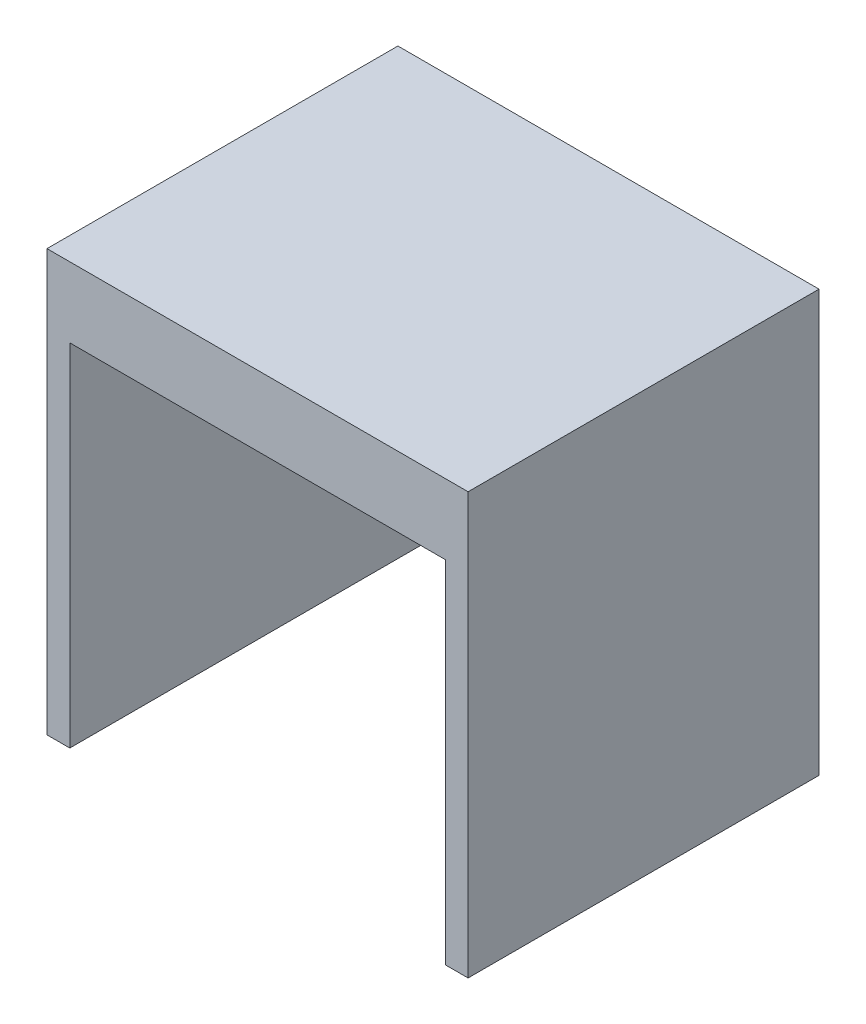
ISO-10303-21;
HEADER;
FILE_DESCRIPTION(('STEP AP214'),'2;1');
FILE_NAME('part.step','',(''),(''),'','','');
FILE_SCHEMA(('AUTOMOTIVE_DESIGN { 1 0 10303 214 1 1 1 1 }'));
ENDSEC;
DATA;
#1=APPLICATION_CONTEXT('core data for automotive mechanical design processes');
#2=APPLICATION_PROTOCOL_DEFINITION('international standard','automotive_design',2000,#1);
#3=PRODUCT_CONTEXT('',#1,'mechanical');
#4=PRODUCT('Part','Part','',(#3));
#5=PRODUCT_RELATED_PRODUCT_CATEGORY('part','',(#4));
#6=PRODUCT_DEFINITION_FORMATION('','',#4);
#7=PRODUCT_DEFINITION_CONTEXT('part definition',#1,'design');
#8=PRODUCT_DEFINITION('design','',#6,#7);
#9=PRODUCT_DEFINITION_SHAPE('','',#8);
#10=(LENGTH_UNIT() NAMED_UNIT(*) SI_UNIT(.MILLI.,.METRE.));
#11=(NAMED_UNIT(*) PLANE_ANGLE_UNIT() SI_UNIT($,.RADIAN.));
#12=(NAMED_UNIT(*) SI_UNIT($,.STERADIAN.) SOLID_ANGLE_UNIT());
#13=UNCERTAINTY_MEASURE_WITH_UNIT(LENGTH_MEASURE(1.E-05),#10,'distance_accuracy_value','');
#14=(GEOMETRIC_REPRESENTATION_CONTEXT(3) GLOBAL_UNCERTAINTY_ASSIGNED_CONTEXT((#13)) GLOBAL_UNIT_ASSIGNED_CONTEXT((#10,
#11,#12)) REPRESENTATION_CONTEXT('',''));
#15=CARTESIAN_POINT('',(0.,0.,0.));
#16=DIRECTION('',(0.,0.,1.));
#17=DIRECTION('',(1.,0.,0.));
#18=AXIS2_PLACEMENT_3D('',#15,#16,#17);
#19=CARTESIAN_POINT('',(38.5843649662009,102.731854475561,45.0000000000001));
#20=DIRECTION('',(0.,-1.,0.));
#21=DIRECTION('',(0.,0.,-1.));
#22=AXIS2_PLACEMENT_3D('',#19,#20,#21);
#23=PLANE('',#22);
#24=DIRECTION('',(-1.,0.,0.));
#25=VECTOR('',#24,1.);
#26=CARTESIAN_POINT('',(38.5843649662009,102.731854475561,-49.9999999999999));
#27=LINE('',#26,#25);
#28=CARTESIAN_POINT('',(38.5843649662009,102.731854475561,-49.9999999999999));
#29=VERTEX_POINT('',#28);
#30=CARTESIAN_POINT('',(-46.4156350337991,102.731854475561,-49.9999999999999));
#31=VERTEX_POINT('',#30);
#32=EDGE_CURVE('E191',#29,#31,#27,.T.);
#33=ORIENTED_EDGE('',*,*,#32,.T.);
#34=DIRECTION('',(0.,0.,-1.));
#35=VECTOR('',#34,1.);
#36=CARTESIAN_POINT('',(-46.4156350337991,102.731854475561,45.0000000000001));
#37=LINE('',#36,#35);
#38=CARTESIAN_POINT('',(-46.4156350337991,102.731854475561,45.0000000000001));
#39=VERTEX_POINT('',#38);
#40=EDGE_CURVE('E212',#39,#31,#37,.T.);
#41=ORIENTED_EDGE('',*,*,#40,.F.);
#42=DIRECTION('',(-1.,0.,0.));
#43=VECTOR('',#42,1.);
#44=CARTESIAN_POINT('',(38.5843649662009,102.731854475561,45.0000000000001));
#45=LINE('',#44,#43);
#46=CARTESIAN_POINT('',(38.5843649662009,102.731854475561,45.0000000000001));
#47=VERTEX_POINT('',#46);
#48=EDGE_CURVE('E203',#47,#39,#45,.T.);
#49=ORIENTED_EDGE('',*,*,#48,.F.);
#50=DIRECTION('',(0.,0.,-1.));
#51=VECTOR('',#50,1.);
#52=CARTESIAN_POINT('',(38.5843649662009,102.731854475561,45.0000000000001));
#53=LINE('',#52,#51);
#54=EDGE_CURVE('E220',#47,#29,#53,.T.);
#55=ORIENTED_EDGE('',*,*,#54,.T.);
#56=EDGE_LOOP('',(#33,#41,#49,#55));
#57=FACE_BOUND('',#56,.T.);
#58=DIRECTION('',(1.,0.,0.));
#59=VECTOR('',#58,1.);
#60=CARTESIAN_POINT('',(36.83780558238,102.731854475561,40.0000000000001));
#61=LINE('',#60,#59);
#62=CARTESIAN_POINT('',(-42.7318544755611,102.731854475561,40.0000000000001));
#63=VERTEX_POINT('',#62);
#64=CARTESIAN_POINT('',(36.83780558238,102.731854475561,40.0000000000001));
#65=VERTEX_POINT('',#64);
#66=EDGE_CURVE('E157',#63,#65,#61,.T.);
#67=ORIENTED_EDGE('',*,*,#66,.F.);
#68=DIRECTION('',(0.,0.,-1.));
#69=VECTOR('',#68,1.);
#70=CARTESIAN_POINT('',(-42.7318544755611,102.731854475561,40.0000000000001));
#71=LINE('',#70,#69);
#72=CARTESIAN_POINT('',(-42.7318544755611,102.731854475561,0.));
#73=VERTEX_POINT('',#72);
#74=EDGE_CURVE('E190',#63,#73,#71,.T.);
#75=ORIENTED_EDGE('',*,*,#74,.T.);
#76=DIRECTION('',(1.,0.,0.));
#77=VECTOR('',#76,1.);
#78=CARTESIAN_POINT('',(36.83780558238,102.731854475561,0.));
#79=LINE('',#78,#77);
#80=CARTESIAN_POINT('',(36.83780558238,102.731854475561,0.));
#81=VERTEX_POINT('',#80);
#82=EDGE_CURVE('E166',#73,#81,#79,.T.);
#83=ORIENTED_EDGE('',*,*,#82,.T.);
#84=DIRECTION('',(0.,0.,-1.));
#85=VECTOR('',#84,1.);
#86=CARTESIAN_POINT('',(36.83780558238,102.731854475561,40.0000000000001));
#87=LINE('',#86,#85);
#88=EDGE_CURVE('E184',#65,#81,#87,.T.);
#89=ORIENTED_EDGE('',*,*,#88,.F.);
#90=EDGE_LOOP('',(#67,#75,#83,#89));
#91=FACE_BOUND('',#90,.T.);
#92=ADVANCED_FACE('F39',(#57,#91),#23,.F.);
#93=CARTESIAN_POINT('',(0.,0.,0.));
#94=DIRECTION('',(0.,1.,0.));
#95=DIRECTION('',(0.,0.,1.));
#96=AXIS2_PLACEMENT_3D('',#93,#94,#95);
#97=PLANE('',#96);
#98=DIRECTION('',(0.,0.,1.));
#99=VECTOR('',#98,1.);
#100=CARTESIAN_POINT('',(53.5,0.,60.));
#101=LINE('',#100,#99);
#102=CARTESIAN_POINT('',(53.5,0.,-49.9999999999999));
#103=VERTEX_POINT('',#102);
#104=CARTESIAN_POINT('',(53.5,0.,50.));
#105=VERTEX_POINT('',#104);
#106=EDGE_CURVE('E216',#103,#105,#101,.T.);
#107=ORIENTED_EDGE('',*,*,#106,.F.);
#108=DIRECTION('',(-1.,0.,0.));
#109=VECTOR('',#108,1.);
#110=CARTESIAN_POINT('',(-60.0000000000002,0.,-49.9999999999999));
#111=LINE('',#110,#109);
#112=CARTESIAN_POINT('',(59.9999999999998,0.,-49.9999999999999));
#113=VERTEX_POINT('',#112);
#114=EDGE_CURVE('E255',#113,#103,#111,.T.);
#115=ORIENTED_EDGE('',*,*,#114,.F.);
#116=DIRECTION('',(0.,0.,-1.));
#117=VECTOR('',#116,1.);
#118=CARTESIAN_POINT('',(59.9999999999998,0.,-49.9999999999999));
#119=LINE('',#118,#117);
#120=CARTESIAN_POINT('',(59.9999999999999,0.,50.));
#121=VERTEX_POINT('',#120);
#122=EDGE_CURVE('E239',#121,#113,#119,.T.);
#123=ORIENTED_EDGE('',*,*,#122,.F.);
#124=DIRECTION('',(1.,0.,0.));
#125=VECTOR('',#124,1.);
#126=CARTESIAN_POINT('',(-60.0000000000001,0.,50.));
#127=LINE('',#126,#125);
#128=EDGE_CURVE('E259',#105,#121,#127,.T.);
#129=ORIENTED_EDGE('',*,*,#128,.F.);
#130=EDGE_LOOP('',(#107,#115,#123,#129));
#131=FACE_BOUND('',#130,.T.);
#132=ADVANCED_FACE('F308',(#131),#97,.F.);
#133=DIRECTION('',(0.,0.,-1.));
#134=VECTOR('',#133,1.);
#135=CARTESIAN_POINT('',(-53.5,0.,60.));
#136=LINE('',#135,#134);
#137=CARTESIAN_POINT('',(-53.5,0.,50.));
#138=VERTEX_POINT('',#137);
#139=CARTESIAN_POINT('',(-53.5,0.,-49.9999999999999));
#140=VERTEX_POINT('',#139);
#141=EDGE_CURVE('E227',#138,#140,#136,.T.);
#142=ORIENTED_EDGE('',*,*,#141,.F.);
#143=CARTESIAN_POINT('',(-60.0000000000001,0.,50.));
#144=VERTEX_POINT('',#143);
#145=EDGE_CURVE('E241',#144,#138,#127,.T.);
#146=ORIENTED_EDGE('',*,*,#145,.F.);
#147=DIRECTION('',(0.,0.,1.));
#148=VECTOR('',#147,1.);
#149=CARTESIAN_POINT('',(-60.0000000000002,0.,-49.9999999999999));
#150=LINE('',#149,#148);
#151=CARTESIAN_POINT('',(-60.0000000000002,0.,-49.9999999999999));
#152=VERTEX_POINT('',#151);
#153=EDGE_CURVE('E260',#152,#144,#150,.T.);
#154=ORIENTED_EDGE('',*,*,#153,.F.);
#155=EDGE_CURVE('E251',#140,#152,#111,.T.);
#156=ORIENTED_EDGE('',*,*,#155,.F.);
#157=EDGE_LOOP('',(#142,#146,#154,#156));
#158=FACE_BOUND('',#157,.T.);
#159=ADVANCED_FACE('F283',(#158),#97,.F.);
#160=CARTESIAN_POINT('',(59.9999999999998,120.,-49.9999999999999));
#161=DIRECTION('',(-1.,0.,0.));
#162=DIRECTION('',(0.,0.,1.));
#163=AXIS2_PLACEMENT_3D('',#160,#161,#162);
#164=PLANE('',#163);
#165=ORIENTED_EDGE('',*,*,#122,.T.);
#166=DIRECTION('',(0.,-1.,0.));
#167=VECTOR('',#166,1.);
#168=CARTESIAN_POINT('',(59.9999999999998,120.,-49.9999999999999));
#169=LINE('',#168,#167);
#170=CARTESIAN_POINT('',(59.9999999999998,120.,-49.9999999999999));
#171=VERTEX_POINT('',#170);
#172=EDGE_CURVE('E269',#171,#113,#169,.T.);
#173=ORIENTED_EDGE('',*,*,#172,.F.);
#174=DIRECTION('',(0.,0.,-1.));
#175=VECTOR('',#174,1.);
#176=CARTESIAN_POINT('',(59.9999999999998,120.,-49.9999999999999));
#177=LINE('',#176,#175);
#178=CARTESIAN_POINT('',(59.9999999999999,120.,50.));
#179=VERTEX_POINT('',#178);
#180=EDGE_CURVE('E238',#179,#171,#177,.T.);
#181=ORIENTED_EDGE('',*,*,#180,.F.);
#182=DIRECTION('',(0.,-1.,0.));
#183=VECTOR('',#182,1.);
#184=CARTESIAN_POINT('',(59.9999999999999,120.,50.));
#185=LINE('',#184,#183);
#186=EDGE_CURVE('E246',#179,#121,#185,.T.);
#187=ORIENTED_EDGE('',*,*,#186,.T.);
#188=EDGE_LOOP('',(#165,#173,#181,#187));
#189=FACE_BOUND('',#188,.T.);
#190=ADVANCED_FACE('F41',(#189),#164,.F.);
#191=CARTESIAN_POINT('',(-60.0000000000002,120.,-49.9999999999999));
#192=DIRECTION('',(0.,0.,1.));
#193=DIRECTION('',(1.,0.,0.));
#194=AXIS2_PLACEMENT_3D('',#191,#192,#193);
#195=PLANE('',#194);
#196=DIRECTION('',(1.,0.,0.));
#197=VECTOR('',#196,1.);
#198=CARTESIAN_POINT('',(38.5843649662009,115.731854475561,-49.9999999999999));
#199=LINE('',#198,#197);
#200=CARTESIAN_POINT('',(-46.4156350337991,115.731854475561,-49.9999999999999));
#201=VERTEX_POINT('',#200);
#202=CARTESIAN_POINT('',(38.5843649662009,115.731854475561,-49.9999999999999));
#203=VERTEX_POINT('',#202);
#204=EDGE_CURVE('E206',#201,#203,#199,.T.);
#205=ORIENTED_EDGE('',*,*,#204,.F.);
#206=DIRECTION('',(0.,1.,0.));
#207=VECTOR('',#206,1.);
#208=CARTESIAN_POINT('',(-46.4156350337991,115.731854475561,-49.9999999999999));
#209=LINE('',#208,#207);
#210=EDGE_CURVE('E187',#31,#201,#209,.T.);
#211=ORIENTED_EDGE('',*,*,#210,.F.);
#212=ORIENTED_EDGE('',*,*,#32,.F.);
#213=DIRECTION('',(0.,-1.,0.));
#214=VECTOR('',#213,1.);
#215=CARTESIAN_POINT('',(38.5843649662009,115.731854475561,-49.9999999999999));
#216=LINE('',#215,#214);
#217=EDGE_CURVE('E207',#203,#29,#216,.T.);
#218=ORIENTED_EDGE('',*,*,#217,.F.);
#219=EDGE_LOOP('',(#205,#211,#212,#218));
#220=FACE_BOUND('',#219,.T.);
#221=ORIENTED_EDGE('',*,*,#114,.T.);
#222=DIRECTION('',(0.,1.,0.));
#223=VECTOR('',#222,1.);
#224=CARTESIAN_POINT('',(53.5,120.,-49.9999999999999));
#225=LINE('',#224,#223);
#226=CARTESIAN_POINT('',(53.5,100.,-49.9999999999999));
#227=VERTEX_POINT('',#226);
#228=EDGE_CURVE('E237',#103,#227,#225,.T.);
#229=ORIENTED_EDGE('',*,*,#228,.T.);
#230=DIRECTION('',(1.,0.,0.));
#231=VECTOR('',#230,1.);
#232=CARTESIAN_POINT('',(-60.0000000000002,100.,-49.9999999999999));
#233=LINE('',#232,#231);
#234=CARTESIAN_POINT('',(-53.5,100.,-49.9999999999999));
#235=VERTEX_POINT('',#234);
#236=EDGE_CURVE('E226',#235,#227,#233,.T.);
#237=ORIENTED_EDGE('',*,*,#236,.F.);
#238=DIRECTION('',(0.,-1.,0.));
#239=VECTOR('',#238,1.);
#240=CARTESIAN_POINT('',(-53.5,120.,-49.9999999999999));
#241=LINE('',#240,#239);
#242=EDGE_CURVE('E232',#235,#140,#241,.T.);
#243=ORIENTED_EDGE('',*,*,#242,.T.);
#244=ORIENTED_EDGE('',*,*,#155,.T.);
#245=DIRECTION('',(0.,-1.,0.));
#246=VECTOR('',#245,1.);
#247=CARTESIAN_POINT('',(-60.0000000000002,120.,-49.9999999999999));
#248=LINE('',#247,#246);
#249=CARTESIAN_POINT('',(-60.0000000000002,120.,-49.9999999999999));
#250=VERTEX_POINT('',#249);
#251=EDGE_CURVE('E270',#250,#152,#248,.T.);
#252=ORIENTED_EDGE('',*,*,#251,.F.);
#253=DIRECTION('',(-1.,0.,0.));
#254=VECTOR('',#253,1.);
#255=CARTESIAN_POINT('',(-60.0000000000002,120.,-49.9999999999999));
#256=LINE('',#255,#254);
#257=EDGE_CURVE('E244',#171,#250,#256,.T.);
#258=ORIENTED_EDGE('',*,*,#257,.F.);
#259=ORIENTED_EDGE('',*,*,#172,.T.);
#260=EDGE_LOOP('',(#221,#229,#237,#243,#244,#252,#258,#259));
#261=FACE_BOUND('',#260,.T.);
#262=ADVANCED_FACE('F290',(#220,#261),#195,.F.);
#263=CARTESIAN_POINT('',(-60.0000000000002,120.,-49.9999999999999));
#264=DIRECTION('',(1.,0.,0.));
#265=DIRECTION('',(0.,0.,-1.));
#266=AXIS2_PLACEMENT_3D('',#263,#264,#265);
#267=PLANE('',#266);
#268=ORIENTED_EDGE('',*,*,#153,.T.);
#269=DIRECTION('',(0.,-1.,0.));
#270=VECTOR('',#269,1.);
#271=CARTESIAN_POINT('',(-60.0000000000001,120.,50.));
#272=LINE('',#271,#270);
#273=CARTESIAN_POINT('',(-60.0000000000001,120.,50.));
#274=VERTEX_POINT('',#273);
#275=EDGE_CURVE('E262',#274,#144,#272,.T.);
#276=ORIENTED_EDGE('',*,*,#275,.F.);
#277=DIRECTION('',(0.,0.,1.));
#278=VECTOR('',#277,1.);
#279=CARTESIAN_POINT('',(-60.0000000000002,120.,-49.9999999999999));
#280=LINE('',#279,#278);
#281=EDGE_CURVE('E248',#250,#274,#280,.T.);
#282=ORIENTED_EDGE('',*,*,#281,.F.);
#283=ORIENTED_EDGE('',*,*,#251,.T.);
#284=EDGE_LOOP('',(#268,#276,#282,#283));
#285=FACE_BOUND('',#284,.T.);
#286=ADVANCED_FACE('F291',(#285),#267,.F.);
#287=CARTESIAN_POINT('',(-60.0000000000001,120.,50.));
#288=DIRECTION('',(0.,0.,-1.));
#289=DIRECTION('',(-1.,0.,0.));
#290=AXIS2_PLACEMENT_3D('',#287,#288,#289);
#291=PLANE('',#290);
#292=DIRECTION('',(-1.,0.,0.));
#293=VECTOR('',#292,1.);
#294=CARTESIAN_POINT('',(-60.0000000000001,100.,50.));
#295=LINE('',#294,#293);
#296=CARTESIAN_POINT('',(53.5,100.,50.));
#297=VERTEX_POINT('',#296);
#298=CARTESIAN_POINT('',(-53.5,100.,50.));
#299=VERTEX_POINT('',#298);
#300=EDGE_CURVE('E272',#297,#299,#295,.T.);
#301=ORIENTED_EDGE('',*,*,#300,.F.);
#302=DIRECTION('',(0.,-1.,0.));
#303=VECTOR('',#302,1.);
#304=CARTESIAN_POINT('',(53.5,120.,50.));
#305=LINE('',#304,#303);
#306=EDGE_CURVE('E11',#297,#105,#305,.T.);
#307=ORIENTED_EDGE('',*,*,#306,.T.);
#308=ORIENTED_EDGE('',*,*,#128,.T.);
#309=ORIENTED_EDGE('',*,*,#186,.F.);
#310=DIRECTION('',(1.,0.,0.));
#311=VECTOR('',#310,1.);
#312=CARTESIAN_POINT('',(-60.0000000000001,120.,50.));
#313=LINE('',#312,#311);
#314=EDGE_CURVE('E247',#274,#179,#313,.T.);
#315=ORIENTED_EDGE('',*,*,#314,.F.);
#316=ORIENTED_EDGE('',*,*,#275,.T.);
#317=ORIENTED_EDGE('',*,*,#145,.T.);
#318=DIRECTION('',(0.,1.,0.));
#319=VECTOR('',#318,1.);
#320=CARTESIAN_POINT('',(-53.5,120.,50.));
#321=LINE('',#320,#319);
#322=EDGE_CURVE('E50',#138,#299,#321,.T.);
#323=ORIENTED_EDGE('',*,*,#322,.T.);
#324=EDGE_LOOP('',(#301,#307,#308,#309,#315,#316,#317,#323));
#325=FACE_BOUND('',#324,.T.);
#326=ADVANCED_FACE('F280',(#325),#291,.F.);
#327=CARTESIAN_POINT('',(0.,120.,0.));
#328=DIRECTION('',(0.,1.,0.));
#329=DIRECTION('',(0.,0.,1.));
#330=AXIS2_PLACEMENT_3D('',#327,#328,#329);
#331=PLANE('',#330);
#332=ORIENTED_EDGE('',*,*,#180,.T.);
#333=ORIENTED_EDGE('',*,*,#257,.T.);
#334=ORIENTED_EDGE('',*,*,#281,.T.);
#335=ORIENTED_EDGE('',*,*,#314,.T.);
#336=EDGE_LOOP('',(#332,#333,#334,#335));
#337=FACE_BOUND('',#336,.T.);
#338=ADVANCED_FACE('F300',(#337),#331,.T.);
#339=CARTESIAN_POINT('',(53.5,100.,60.));
#340=DIRECTION('',(1.,0.,0.));
#341=DIRECTION('',(0.,0.,-1.));
#342=AXIS2_PLACEMENT_3D('',#339,#340,#341);
#343=PLANE('',#342);
#344=ORIENTED_EDGE('',*,*,#106,.T.);
#345=ORIENTED_EDGE('',*,*,#306,.F.);
#346=DIRECTION('',(0.,0.,1.));
#347=VECTOR('',#346,1.);
#348=CARTESIAN_POINT('',(53.5,100.,60.));
#349=LINE('',#348,#347);
#350=EDGE_CURVE('E224',#227,#297,#349,.T.);
#351=ORIENTED_EDGE('',*,*,#350,.F.);
#352=ORIENTED_EDGE('',*,*,#228,.F.);
#353=EDGE_LOOP('',(#344,#345,#351,#352));
#354=FACE_BOUND('',#353,.T.);
#355=ADVANCED_FACE('F310',(#354),#343,.F.);
#356=CARTESIAN_POINT('',(-53.5,100.,60.));
#357=DIRECTION('',(-1.,0.,0.));
#358=DIRECTION('',(0.,0.,1.));
#359=AXIS2_PLACEMENT_3D('',#356,#357,#358);
#360=PLANE('',#359);
#361=DIRECTION('',(0.,0.,-1.));
#362=VECTOR('',#361,1.);
#363=CARTESIAN_POINT('',(-53.5,100.,60.));
#364=LINE('',#363,#362);
#365=EDGE_CURVE('E223',#299,#235,#364,.T.);
#366=ORIENTED_EDGE('',*,*,#365,.F.);
#367=ORIENTED_EDGE('',*,*,#322,.F.);
#368=ORIENTED_EDGE('',*,*,#141,.T.);
#369=ORIENTED_EDGE('',*,*,#242,.F.);
#370=EDGE_LOOP('',(#366,#367,#368,#369));
#371=FACE_BOUND('',#370,.T.);
#372=ADVANCED_FACE('F285',(#371),#360,.F.);
#373=CARTESIAN_POINT('',(0.,100.,0.));
#374=DIRECTION('',(0.,-1.,0.));
#375=DIRECTION('',(0.,0.,-1.));
#376=AXIS2_PLACEMENT_3D('',#373,#374,#375);
#377=PLANE('',#376);
#378=DIRECTION('',(-1.,0.,0.));
#379=VECTOR('',#378,1.);
#380=CARTESIAN_POINT('',(36.83780558238,100.,40.0000000000001));
#381=LINE('',#380,#379);
#382=CARTESIAN_POINT('',(36.83780558238,100.,40.0000000000001));
#383=VERTEX_POINT('',#382);
#384=CARTESIAN_POINT('',(-42.7318544755611,100.,40.0000000000001));
#385=VERTEX_POINT('',#384);
#386=EDGE_CURVE('E164',#383,#385,#381,.T.);
#387=ORIENTED_EDGE('',*,*,#386,.F.);
#388=DIRECTION('',(0.,0.,-1.));
#389=VECTOR('',#388,1.);
#390=CARTESIAN_POINT('',(36.83780558238,100.,40.0000000000001));
#391=LINE('',#390,#389);
#392=CARTESIAN_POINT('',(36.83780558238,100.,0.));
#393=VERTEX_POINT('',#392);
#394=EDGE_CURVE('E147',#383,#393,#391,.T.);
#395=ORIENTED_EDGE('',*,*,#394,.T.);
#396=DIRECTION('',(-1.,0.,0.));
#397=VECTOR('',#396,1.);
#398=CARTESIAN_POINT('',(36.83780558238,100.,0.));
#399=LINE('',#398,#397);
#400=CARTESIAN_POINT('',(-42.7318544755611,100.,0.));
#401=VERTEX_POINT('',#400);
#402=EDGE_CURVE('E180',#393,#401,#399,.T.);
#403=ORIENTED_EDGE('',*,*,#402,.T.);
#404=DIRECTION('',(0.,0.,-1.));
#405=VECTOR('',#404,1.);
#406=CARTESIAN_POINT('',(-42.7318544755611,100.,40.0000000000001));
#407=LINE('',#406,#405);
#408=EDGE_CURVE('E158',#385,#401,#407,.T.);
#409=ORIENTED_EDGE('',*,*,#408,.F.);
#410=EDGE_LOOP('',(#387,#395,#403,#409));
#411=FACE_BOUND('',#410,.T.);
#412=ORIENTED_EDGE('',*,*,#236,.T.);
#413=ORIENTED_EDGE('',*,*,#350,.T.);
#414=ORIENTED_EDGE('',*,*,#300,.T.);
#415=ORIENTED_EDGE('',*,*,#365,.T.);
#416=EDGE_LOOP('',(#412,#413,#414,#415));
#417=FACE_BOUND('',#416,.T.);
#418=ADVANCED_FACE('F172',(#411,#417),#377,.T.);
#419=CARTESIAN_POINT('',(-46.4156350337991,115.731854475561,45.0000000000001));
#420=DIRECTION('',(-1.,0.,0.));
#421=DIRECTION('',(0.,0.,1.));
#422=AXIS2_PLACEMENT_3D('',#419,#420,#421);
#423=PLANE('',#422);
#424=ORIENTED_EDGE('',*,*,#210,.T.);
#425=DIRECTION('',(0.,0.,-1.));
#426=VECTOR('',#425,1.);
#427=CARTESIAN_POINT('',(-46.4156350337991,115.731854475561,45.0000000000001));
#428=LINE('',#427,#426);
#429=CARTESIAN_POINT('',(-46.4156350337991,115.731854475561,45.0000000000001));
#430=VERTEX_POINT('',#429);
#431=EDGE_CURVE('E204',#430,#201,#428,.T.);
#432=ORIENTED_EDGE('',*,*,#431,.F.);
#433=DIRECTION('',(0.,1.,0.));
#434=VECTOR('',#433,1.);
#435=CARTESIAN_POINT('',(-46.4156350337991,115.731854475561,45.0000000000001));
#436=LINE('',#435,#434);
#437=EDGE_CURVE('E193',#39,#430,#436,.T.);
#438=ORIENTED_EDGE('',*,*,#437,.F.);
#439=ORIENTED_EDGE('',*,*,#40,.T.);
#440=EDGE_LOOP('',(#424,#432,#438,#439));
#441=FACE_BOUND('',#440,.T.);
#442=ADVANCED_FACE('F315',(#441),#423,.F.);
#443=CARTESIAN_POINT('',(38.5843649662009,115.731854475561,45.0000000000001));
#444=DIRECTION('',(1.,0.,0.));
#445=DIRECTION('',(0.,0.,-1.));
#446=AXIS2_PLACEMENT_3D('',#443,#444,#445);
#447=PLANE('',#446);
#448=ORIENTED_EDGE('',*,*,#217,.T.);
#449=ORIENTED_EDGE('',*,*,#54,.F.);
#450=DIRECTION('',(0.,-1.,0.));
#451=VECTOR('',#450,1.);
#452=CARTESIAN_POINT('',(38.5843649662009,115.731854475561,45.0000000000001));
#453=LINE('',#452,#451);
#454=CARTESIAN_POINT('',(38.5843649662009,115.731854475561,45.0000000000001));
#455=VERTEX_POINT('',#454);
#456=EDGE_CURVE('E196',#455,#47,#453,.T.);
#457=ORIENTED_EDGE('',*,*,#456,.F.);
#458=DIRECTION('',(0.,0.,-1.));
#459=VECTOR('',#458,1.);
#460=CARTESIAN_POINT('',(38.5843649662009,115.731854475561,45.0000000000001));
#461=LINE('',#460,#459);
#462=EDGE_CURVE('E218',#455,#203,#461,.T.);
#463=ORIENTED_EDGE('',*,*,#462,.T.);
#464=EDGE_LOOP('',(#448,#449,#457,#463));
#465=FACE_BOUND('',#464,.T.);
#466=ADVANCED_FACE('F317',(#465),#447,.F.);
#467=CARTESIAN_POINT('',(38.5843649662009,115.731854475561,45.0000000000001));
#468=DIRECTION('',(0.,1.,0.));
#469=DIRECTION('',(0.,0.,1.));
#470=AXIS2_PLACEMENT_3D('',#467,#468,#469);
#471=PLANE('',#470);
#472=ORIENTED_EDGE('',*,*,#204,.T.);
#473=ORIENTED_EDGE('',*,*,#462,.F.);
#474=DIRECTION('',(1.,0.,0.));
#475=VECTOR('',#474,1.);
#476=CARTESIAN_POINT('',(38.5843649662009,115.731854475561,45.0000000000001));
#477=LINE('',#476,#475);
#478=EDGE_CURVE('E195',#430,#455,#477,.T.);
#479=ORIENTED_EDGE('',*,*,#478,.F.);
#480=ORIENTED_EDGE('',*,*,#431,.T.);
#481=EDGE_LOOP('',(#472,#473,#479,#480));
#482=FACE_BOUND('',#481,.T.);
#483=ADVANCED_FACE('F339',(#482),#471,.F.);
#484=CARTESIAN_POINT('',(0.,0.,45.0000000000001));
#485=DIRECTION('',(0.,0.,-1.));
#486=DIRECTION('',(-1.,0.,0.));
#487=AXIS2_PLACEMENT_3D('',#484,#485,#486);
#488=PLANE('',#487);
#489=ORIENTED_EDGE('',*,*,#437,.T.);
#490=ORIENTED_EDGE('',*,*,#478,.T.);
#491=ORIENTED_EDGE('',*,*,#456,.T.);
#492=ORIENTED_EDGE('',*,*,#48,.T.);
#493=EDGE_LOOP('',(#489,#490,#491,#492));
#494=FACE_BOUND('',#493,.T.);
#495=ADVANCED_FACE('F331',(#494),#488,.T.);
#496=CARTESIAN_POINT('',(36.83780558238,102.731854475561,40.0000000000001));
#497=DIRECTION('',(1.,0.,0.));
#498=DIRECTION('',(0.,0.,-1.));
#499=AXIS2_PLACEMENT_3D('',#496,#497,#498);
#500=PLANE('',#499);
#501=DIRECTION('',(0.,-1.,0.));
#502=VECTOR('',#501,1.);
#503=CARTESIAN_POINT('',(36.83780558238,102.731854475561,0.));
#504=LINE('',#503,#502);
#505=EDGE_CURVE('E56',#81,#393,#504,.T.);
#506=ORIENTED_EDGE('',*,*,#505,.T.);
#507=ORIENTED_EDGE('',*,*,#394,.F.);
#508=DIRECTION('',(0.,-1.,0.));
#509=VECTOR('',#508,1.);
#510=CARTESIAN_POINT('',(36.83780558238,102.731854475561,40.0000000000001));
#511=LINE('',#510,#509);
#512=EDGE_CURVE('E153',#65,#383,#511,.T.);
#513=ORIENTED_EDGE('',*,*,#512,.F.);
#514=ORIENTED_EDGE('',*,*,#88,.T.);
#515=EDGE_LOOP('',(#506,#507,#513,#514));
#516=FACE_BOUND('',#515,.T.);
#517=ADVANCED_FACE('F155',(#516),#500,.F.);
#518=CARTESIAN_POINT('',(-42.7318544755611,102.731854475561,40.0000000000001));
#519=DIRECTION('',(-1.,0.,0.));
#520=DIRECTION('',(0.,0.,1.));
#521=AXIS2_PLACEMENT_3D('',#518,#519,#520);
#522=PLANE('',#521);
#523=DIRECTION('',(0.,1.,0.));
#524=VECTOR('',#523,1.);
#525=CARTESIAN_POINT('',(-42.7318544755611,102.731854475561,0.));
#526=LINE('',#525,#524);
#527=EDGE_CURVE('E53',#401,#73,#526,.T.);
#528=ORIENTED_EDGE('',*,*,#527,.T.);
#529=ORIENTED_EDGE('',*,*,#74,.F.);
#530=DIRECTION('',(0.,1.,0.));
#531=VECTOR('',#530,1.);
#532=CARTESIAN_POINT('',(-42.7318544755611,102.731854475561,40.0000000000001));
#533=LINE('',#532,#531);
#534=EDGE_CURVE('E174',#385,#63,#533,.T.);
#535=ORIENTED_EDGE('',*,*,#534,.F.);
#536=ORIENTED_EDGE('',*,*,#408,.T.);
#537=EDGE_LOOP('',(#528,#529,#535,#536));
#538=FACE_BOUND('',#537,.T.);
#539=ADVANCED_FACE('F418',(#538),#522,.F.);
#540=CARTESIAN_POINT('',(0.,0.,40.0000000000001));
#541=DIRECTION('',(0.,0.,-1.));
#542=DIRECTION('',(-1.,0.,0.));
#543=AXIS2_PLACEMENT_3D('',#540,#541,#542);
#544=PLANE('',#543);
#545=ORIENTED_EDGE('',*,*,#512,.T.);
#546=ORIENTED_EDGE('',*,*,#386,.T.);
#547=ORIENTED_EDGE('',*,*,#534,.T.);
#548=ORIENTED_EDGE('',*,*,#66,.T.);
#549=EDGE_LOOP('',(#545,#546,#547,#548));
#550=FACE_BOUND('',#549,.T.);
#551=ADVANCED_FACE('F162',(#550),#544,.T.);
#552=CARTESIAN_POINT('',(0.,0.,0.));
#553=DIRECTION('',(0.,0.,-1.));
#554=DIRECTION('',(-1.,0.,0.));
#555=AXIS2_PLACEMENT_3D('',#552,#553,#554);
#556=PLANE('',#555);
#557=ORIENTED_EDGE('',*,*,#505,.F.);
#558=ORIENTED_EDGE('',*,*,#82,.F.);
#559=ORIENTED_EDGE('',*,*,#527,.F.);
#560=ORIENTED_EDGE('',*,*,#402,.F.);
#561=EDGE_LOOP('',(#557,#558,#559,#560));
#562=FACE_BOUND('',#561,.T.);
#563=ADVANCED_FACE('F433',(#562),#556,.F.);
#564=CLOSED_SHELL('',(#92,#132,#159,#190,#262,#286,#326,#338,#355,#372,#418,#442,#466,#483,#495,
#517,#539,#551,#563));
#565=MANIFOLD_SOLID_BREP('B2',#564);
#566=ADVANCED_BREP_SHAPE_REPRESENTATION('',(#18,#565),#14);
#567=SHAPE_DEFINITION_REPRESENTATION(#9,#566);
ENDSEC;
END-ISO-10303-21;
